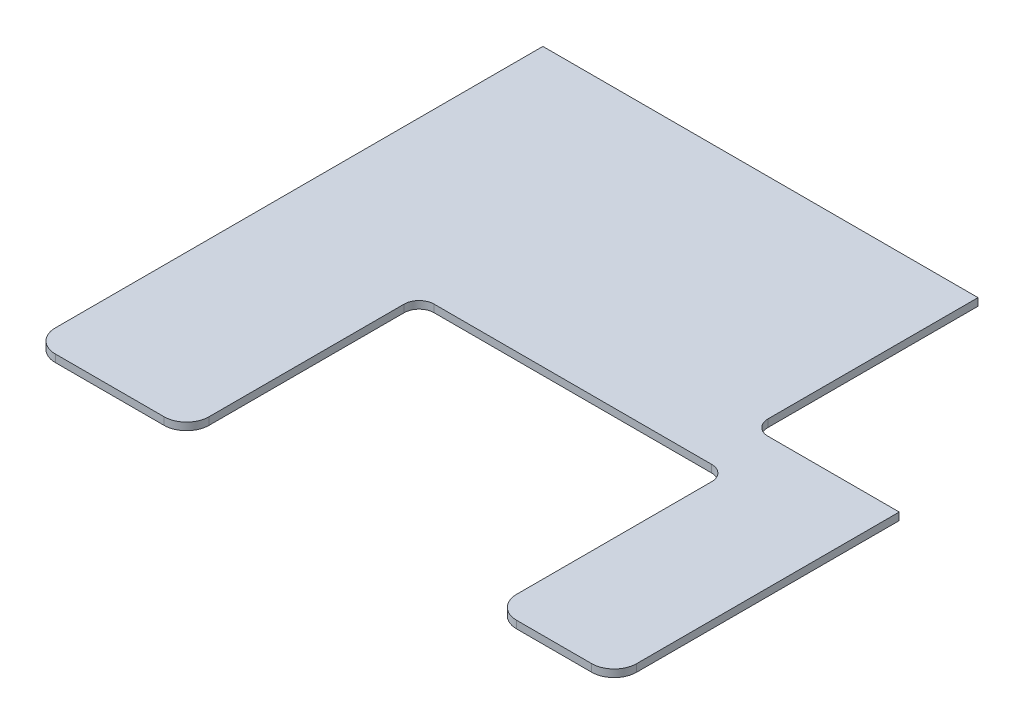
ISO-10303-21;
HEADER;
FILE_DESCRIPTION(('STEP AP214'),'2;1');
FILE_NAME('part.step','',(''),(''),'','','');
FILE_SCHEMA(('AUTOMOTIVE_DESIGN { 1 0 10303 214 1 1 1 1 }'));
ENDSEC;
DATA;
#1=APPLICATION_CONTEXT('core data for automotive mechanical design processes');
#2=APPLICATION_PROTOCOL_DEFINITION('international standard','automotive_design',2000,#1);
#3=PRODUCT_CONTEXT('',#1,'mechanical');
#4=PRODUCT('Part','Part','',(#3));
#5=PRODUCT_RELATED_PRODUCT_CATEGORY('part','',(#4));
#6=PRODUCT_DEFINITION_FORMATION('','',#4);
#7=PRODUCT_DEFINITION_CONTEXT('part definition',#1,'design');
#8=PRODUCT_DEFINITION('design','',#6,#7);
#9=PRODUCT_DEFINITION_SHAPE('','',#8);
#10=(LENGTH_UNIT() NAMED_UNIT(*) SI_UNIT(.MILLI.,.METRE.));
#11=(NAMED_UNIT(*) PLANE_ANGLE_UNIT() SI_UNIT($,.RADIAN.));
#12=(NAMED_UNIT(*) SI_UNIT($,.STERADIAN.) SOLID_ANGLE_UNIT());
#13=UNCERTAINTY_MEASURE_WITH_UNIT(LENGTH_MEASURE(1.E-05),#10,'distance_accuracy_value','');
#14=(GEOMETRIC_REPRESENTATION_CONTEXT(3) GLOBAL_UNCERTAINTY_ASSIGNED_CONTEXT((#13)) GLOBAL_UNIT_ASSIGNED_CONTEXT((#10,
#11,#12)) REPRESENTATION_CONTEXT('',''));
#15=CARTESIAN_POINT('',(0.,0.,0.));
#16=DIRECTION('',(0.,0.,1.));
#17=DIRECTION('',(1.,0.,0.));
#18=AXIS2_PLACEMENT_3D('',#15,#16,#17);
#19=CARTESIAN_POINT('',(387.5,10.,340.));
#20=DIRECTION('',(0.,0.,-1.));
#21=DIRECTION('',(-1.,0.,0.));
#22=AXIS2_PLACEMENT_3D('',#19,#20,#21);
#23=PLANE('',#22);
#24=DIRECTION('',(1.,0.,0.));
#25=VECTOR('',#24,1.);
#26=CARTESIAN_POINT('',(387.5,0.,340.));
#27=LINE('',#26,#25);
#28=CARTESIAN_POINT('',(-357.5,0.,340.));
#29=VERTEX_POINT('',#28);
#30=CARTESIAN_POINT('',(-212.5,0.,340.));
#31=VERTEX_POINT('',#30);
#32=EDGE_CURVE('E184',#29,#31,#27,.T.);
#33=ORIENTED_EDGE('',*,*,#32,.T.);
#34=DIRECTION('',(0.,1.,0.));
#35=VECTOR('',#34,1.);
#36=CARTESIAN_POINT('',(-212.5,10.,340.));
#37=LINE('',#36,#35);
#38=CARTESIAN_POINT('',(-212.5,10.,340.));
#39=VERTEX_POINT('',#38);
#40=EDGE_CURVE('E193',#31,#39,#37,.T.);
#41=ORIENTED_EDGE('',*,*,#40,.T.);
#42=DIRECTION('',(1.,0.,0.));
#43=VECTOR('',#42,1.);
#44=CARTESIAN_POINT('',(387.5,10.,340.));
#45=LINE('',#44,#43);
#46=CARTESIAN_POINT('',(-357.5,10.,340.));
#47=VERTEX_POINT('',#46);
#48=EDGE_CURVE('E269',#47,#39,#45,.T.);
#49=ORIENTED_EDGE('',*,*,#48,.F.);
#50=DIRECTION('',(0.,-1.,0.));
#51=VECTOR('',#50,1.);
#52=CARTESIAN_POINT('',(-357.5,10.,340.));
#53=LINE('',#52,#51);
#54=EDGE_CURVE('E190',#47,#29,#53,.T.);
#55=ORIENTED_EDGE('',*,*,#54,.T.);
#56=EDGE_LOOP('',(#33,#41,#49,#55));
#57=FACE_BOUND('',#56,.T.);
#58=ADVANCED_FACE('F34',(#57),#23,.F.);
#59=CARTESIAN_POINT('',(-387.5,10.,340.));
#60=DIRECTION('',(1.,0.,0.));
#61=DIRECTION('',(0.,0.,-1.));
#62=AXIS2_PLACEMENT_3D('',#59,#60,#61);
#63=PLANE('',#62);
#64=DIRECTION('',(0.,0.,1.));
#65=VECTOR('',#64,1.);
#66=CARTESIAN_POINT('',(-387.5,0.,340.));
#67=LINE('',#66,#65);
#68=CARTESIAN_POINT('',(-387.5,0.,-340.));
#69=VERTEX_POINT('',#68);
#70=CARTESIAN_POINT('',(-387.5,0.,310.));
#71=VERTEX_POINT('',#70);
#72=EDGE_CURVE('E177',#69,#71,#67,.T.);
#73=ORIENTED_EDGE('',*,*,#72,.T.);
#74=DIRECTION('',(0.,-1.,0.));
#75=VECTOR('',#74,1.);
#76=CARTESIAN_POINT('',(-387.5,10.,310.));
#77=LINE('',#76,#75);
#78=CARTESIAN_POINT('',(-387.5,10.,310.));
#79=VERTEX_POINT('',#78);
#80=EDGE_CURVE('E212',#71,#79,#77,.F.);
#81=ORIENTED_EDGE('',*,*,#80,.T.);
#82=DIRECTION('',(0.,0.,1.));
#83=VECTOR('',#82,1.);
#84=CARTESIAN_POINT('',(-387.5,10.,340.));
#85=LINE('',#84,#83);
#86=CARTESIAN_POINT('',(-387.5,10.,-340.));
#87=VERTEX_POINT('',#86);
#88=EDGE_CURVE('E178',#87,#79,#85,.T.);
#89=ORIENTED_EDGE('',*,*,#88,.F.);
#90=DIRECTION('',(0.,-1.,0.));
#91=VECTOR('',#90,1.);
#92=CARTESIAN_POINT('',(-387.5,10.,-340.));
#93=LINE('',#92,#91);
#94=EDGE_CURVE('E188',#87,#69,#93,.T.);
#95=ORIENTED_EDGE('',*,*,#94,.T.);
#96=EDGE_LOOP('',(#73,#81,#89,#95));
#97=FACE_BOUND('',#96,.T.);
#98=ADVANCED_FACE('F317',(#97),#63,.F.);
#99=CARTESIAN_POINT('',(257.5,10.,340.));
#100=VERTEX_POINT('',#99);
#101=CARTESIAN_POINT('',(357.5,10.,340.));
#102=VERTEX_POINT('',#101);
#103=EDGE_CURVE('E182',#100,#102,#45,.T.);
#104=ORIENTED_EDGE('',*,*,#103,.F.);
#105=DIRECTION('',(0.,1.,0.));
#106=VECTOR('',#105,1.);
#107=CARTESIAN_POINT('',(257.5,10.,340.));
#108=LINE('',#107,#106);
#109=CARTESIAN_POINT('',(257.5,0.,340.));
#110=VERTEX_POINT('',#109);
#111=EDGE_CURVE('E42',#100,#110,#108,.F.);
#112=ORIENTED_EDGE('',*,*,#111,.T.);
#113=CARTESIAN_POINT('',(357.5,0.,340.));
#114=VERTEX_POINT('',#113);
#115=EDGE_CURVE('E223',#110,#114,#27,.T.);
#116=ORIENTED_EDGE('',*,*,#115,.T.);
#117=DIRECTION('',(0.,-1.,0.));
#118=VECTOR('',#117,1.);
#119=CARTESIAN_POINT('',(357.5,10.,340.));
#120=LINE('',#119,#118);
#121=EDGE_CURVE('E217',#114,#102,#120,.F.);
#122=ORIENTED_EDGE('',*,*,#121,.T.);
#123=EDGE_LOOP('',(#104,#112,#116,#122));
#124=FACE_BOUND('',#123,.T.);
#125=ADVANCED_FACE('F222',(#124),#23,.F.);
#126=CARTESIAN_POINT('',(387.5,10.,340.));
#127=DIRECTION('',(-1.,0.,0.));
#128=DIRECTION('',(0.,0.,1.));
#129=AXIS2_PLACEMENT_3D('',#126,#127,#128);
#130=PLANE('',#129);
#131=DIRECTION('',(0.,0.,-1.));
#132=VECTOR('',#131,1.);
#133=CARTESIAN_POINT('',(387.5,10.,340.));
#134=LINE('',#133,#132);
#135=CARTESIAN_POINT('',(387.5,10.,310.));
#136=VERTEX_POINT('',#135);
#137=CARTESIAN_POINT('',(387.5,10.,-40.0000000000001));
#138=VERTEX_POINT('',#137);
#139=EDGE_CURVE('E270',#136,#138,#134,.T.);
#140=ORIENTED_EDGE('',*,*,#139,.F.);
#141=DIRECTION('',(0.,-1.,0.));
#142=VECTOR('',#141,1.);
#143=CARTESIAN_POINT('',(387.5,10.,310.));
#144=LINE('',#143,#142);
#145=CARTESIAN_POINT('',(387.5,0.,310.));
#146=VERTEX_POINT('',#145);
#147=EDGE_CURVE('E11',#136,#146,#144,.T.);
#148=ORIENTED_EDGE('',*,*,#147,.T.);
#149=DIRECTION('',(0.,0.,-1.));
#150=VECTOR('',#149,1.);
#151=CARTESIAN_POINT('',(387.5,0.,340.));
#152=LINE('',#151,#150);
#153=CARTESIAN_POINT('',(387.5,0.,-40.0000000000001));
#154=VERTEX_POINT('',#153);
#155=EDGE_CURVE('E179',#146,#154,#152,.T.);
#156=ORIENTED_EDGE('',*,*,#155,.T.);
#157=DIRECTION('',(0.,1.,0.));
#158=VECTOR('',#157,1.);
#159=CARTESIAN_POINT('',(387.5,0.,-40.0000000000001));
#160=LINE('',#159,#158);
#161=EDGE_CURVE('E273',#154,#138,#160,.T.);
#162=ORIENTED_EDGE('',*,*,#161,.T.);
#163=EDGE_LOOP('',(#140,#148,#156,#162));
#164=FACE_BOUND('',#163,.T.);
#165=ADVANCED_FACE('F334',(#164),#130,.F.);
#166=CARTESIAN_POINT('',(387.5,10.,-340.));
#167=DIRECTION('',(0.,0.,1.));
#168=DIRECTION('',(1.,0.,0.));
#169=AXIS2_PLACEMENT_3D('',#166,#167,#168);
#170=PLANE('',#169);
#171=DIRECTION('',(-1.,0.,0.));
#172=VECTOR('',#171,1.);
#173=CARTESIAN_POINT('',(387.5,10.,-340.));
#174=LINE('',#173,#172);
#175=CARTESIAN_POINT('',(192.5,10.,-340.));
#176=VERTEX_POINT('',#175);
#177=EDGE_CURVE('E172',#176,#87,#174,.T.);
#178=ORIENTED_EDGE('',*,*,#177,.F.);
#179=DIRECTION('',(0.,1.,0.));
#180=VECTOR('',#179,1.);
#181=CARTESIAN_POINT('',(192.5,0.,-340.));
#182=LINE('',#181,#180);
#183=CARTESIAN_POINT('',(192.5,0.,-340.));
#184=VERTEX_POINT('',#183);
#185=EDGE_CURVE('E158',#184,#176,#182,.T.);
#186=ORIENTED_EDGE('',*,*,#185,.F.);
#187=DIRECTION('',(-1.,0.,0.));
#188=VECTOR('',#187,1.);
#189=CARTESIAN_POINT('',(387.5,0.,-340.));
#190=LINE('',#189,#188);
#191=EDGE_CURVE('E170',#184,#69,#190,.T.);
#192=ORIENTED_EDGE('',*,*,#191,.T.);
#193=ORIENTED_EDGE('',*,*,#94,.F.);
#194=EDGE_LOOP('',(#178,#186,#192,#193));
#195=FACE_BOUND('',#194,.T.);
#196=ADVANCED_FACE('F168',(#195),#170,.F.);
#197=CARTESIAN_POINT('',(0.,10.,0.));
#198=DIRECTION('',(0.,1.,0.));
#199=DIRECTION('',(0.,0.,1.));
#200=AXIS2_PLACEMENT_3D('',#197,#198,#199);
#201=PLANE('',#200);
#202=ORIENTED_EDGE('',*,*,#48,.T.);
#203=CARTESIAN_POINT('',(-212.5,10.,310.));
#204=DIRECTION('',(0.,1.,0.));
#205=DIRECTION('',(0.,0.,1.));
#206=AXIS2_PLACEMENT_3D('',#203,#204,#205);
#207=CIRCLE('',#206,30.);
#208=CARTESIAN_POINT('',(-182.5,10.,310.));
#209=VERTEX_POINT('',#208);
#210=EDGE_CURVE('E202',#39,#209,#207,.T.);
#211=ORIENTED_EDGE('',*,*,#210,.T.);
#212=DIRECTION('',(0.,0.,1.));
#213=VECTOR('',#212,1.);
#214=CARTESIAN_POINT('',(-182.5,10.,340.));
#215=LINE('',#214,#213);
#216=CARTESIAN_POINT('',(-182.5,10.,50.0000000000002));
#217=VERTEX_POINT('',#216);
#218=EDGE_CURVE('E244',#217,#209,#215,.T.);
#219=ORIENTED_EDGE('',*,*,#218,.F.);
#220=CARTESIAN_POINT('',(-162.5,10.,50.));
#221=DIRECTION('',(0.,1.,0.));
#222=DIRECTION('',(0.,0.,-1.));
#223=AXIS2_PLACEMENT_3D('',#220,#221,#222);
#224=CIRCLE('',#223,20.);
#225=CARTESIAN_POINT('',(-162.5,10.,30.));
#226=VERTEX_POINT('',#225);
#227=EDGE_CURVE('E254',#226,#217,#224,.T.);
#228=ORIENTED_EDGE('',*,*,#227,.F.);
#229=DIRECTION('',(-1.,0.,0.));
#230=VECTOR('',#229,1.);
#231=CARTESIAN_POINT('',(-162.5,10.,30.));
#232=LINE('',#231,#230);
#233=CARTESIAN_POINT('',(207.5,10.,30.));
#234=VERTEX_POINT('',#233);
#235=EDGE_CURVE('E246',#234,#226,#232,.T.);
#236=ORIENTED_EDGE('',*,*,#235,.F.);
#237=CARTESIAN_POINT('',(207.5,10.,50.));
#238=DIRECTION('',(0.,1.,0.));
#239=DIRECTION('',(0.,0.,-1.));
#240=AXIS2_PLACEMENT_3D('',#237,#238,#239);
#241=CIRCLE('',#240,20.);
#242=CARTESIAN_POINT('',(227.5,10.,50.0000000000002));
#243=VERTEX_POINT('',#242);
#244=EDGE_CURVE('E243',#243,#234,#241,.T.);
#245=ORIENTED_EDGE('',*,*,#244,.F.);
#246=DIRECTION('',(0.,0.,-1.));
#247=VECTOR('',#246,1.);
#248=CARTESIAN_POINT('',(227.5,10.,340.));
#249=LINE('',#248,#247);
#250=CARTESIAN_POINT('',(227.5,10.,310.));
#251=VERTEX_POINT('',#250);
#252=EDGE_CURVE('E234',#251,#243,#249,.T.);
#253=ORIENTED_EDGE('',*,*,#252,.F.);
#254=CARTESIAN_POINT('',(257.5,10.,310.));
#255=DIRECTION('',(0.,1.,0.));
#256=DIRECTION('',(0.,0.,1.));
#257=AXIS2_PLACEMENT_3D('',#254,#255,#256);
#258=CIRCLE('',#257,30.);
#259=EDGE_CURVE('E198',#251,#100,#258,.T.);
#260=ORIENTED_EDGE('',*,*,#259,.T.);
#261=ORIENTED_EDGE('',*,*,#103,.T.);
#262=CARTESIAN_POINT('',(357.5,10.,310.));
#263=DIRECTION('',(0.,1.,0.));
#264=DIRECTION('',(0.,0.,1.));
#265=AXIS2_PLACEMENT_3D('',#262,#263,#264);
#266=CIRCLE('',#265,30.);
#267=EDGE_CURVE('E196',#102,#136,#266,.T.);
#268=ORIENTED_EDGE('',*,*,#267,.T.);
#269=ORIENTED_EDGE('',*,*,#139,.T.);
#270=DIRECTION('',(1.,0.,0.));
#271=VECTOR('',#270,1.);
#272=CARTESIAN_POINT('',(387.5,10.,-40.0000000000001));
#273=LINE('',#272,#271);
#274=CARTESIAN_POINT('',(212.5,10.,-40.0000000000001));
#275=VERTEX_POINT('',#274);
#276=EDGE_CURVE('E164',#275,#138,#273,.T.);
#277=ORIENTED_EDGE('',*,*,#276,.F.);
#278=CARTESIAN_POINT('',(212.5,10.,-60.0000000000001));
#279=DIRECTION('',(0.,1.,0.));
#280=DIRECTION('',(0.,0.,-1.));
#281=AXIS2_PLACEMENT_3D('',#278,#279,#280);
#282=CIRCLE('',#281,20.);
#283=CARTESIAN_POINT('',(192.5,10.,-60.0000000000003));
#284=VERTEX_POINT('',#283);
#285=EDGE_CURVE('E321',#284,#275,#282,.T.);
#286=ORIENTED_EDGE('',*,*,#285,.F.);
#287=DIRECTION('',(0.,0.,1.));
#288=VECTOR('',#287,1.);
#289=CARTESIAN_POINT('',(192.5,10.,-340.));
#290=LINE('',#289,#288);
#291=EDGE_CURVE('E260',#176,#284,#290,.T.);
#292=ORIENTED_EDGE('',*,*,#291,.F.);
#293=ORIENTED_EDGE('',*,*,#177,.T.);
#294=ORIENTED_EDGE('',*,*,#88,.T.);
#295=CARTESIAN_POINT('',(-357.5,10.,310.));
#296=DIRECTION('',(0.,1.,0.));
#297=DIRECTION('',(0.,0.,1.));
#298=AXIS2_PLACEMENT_3D('',#295,#296,#297);
#299=CIRCLE('',#298,30.);
#300=EDGE_CURVE('E200',#79,#47,#299,.T.);
#301=ORIENTED_EDGE('',*,*,#300,.T.);
#302=EDGE_LOOP('',(#202,#211,#219,#228,#236,#245,#253,#260,#261,#268,#269,#277,#286,#292,#293,
#294,#301));
#303=FACE_BOUND('',#302,.T.);
#304=ADVANCED_FACE('F240',(#303),#201,.T.);
#305=CARTESIAN_POINT('',(0.,0.,0.));
#306=DIRECTION('',(0.,1.,0.));
#307=DIRECTION('',(0.,0.,1.));
#308=AXIS2_PLACEMENT_3D('',#305,#306,#307);
#309=PLANE('',#308);
#310=DIRECTION('',(0.,0.,1.));
#311=VECTOR('',#310,1.);
#312=CARTESIAN_POINT('',(-182.5,0.,340.));
#313=LINE('',#312,#311);
#314=CARTESIAN_POINT('',(-182.5,0.,50.0000000000002));
#315=VERTEX_POINT('',#314);
#316=CARTESIAN_POINT('',(-182.5,0.,310.));
#317=VERTEX_POINT('',#316);
#318=EDGE_CURVE('E257',#315,#317,#313,.T.);
#319=ORIENTED_EDGE('',*,*,#318,.T.);
#320=CARTESIAN_POINT('',(-212.5,0.,310.));
#321=DIRECTION('',(0.,1.,0.));
#322=DIRECTION('',(0.,0.,1.));
#323=AXIS2_PLACEMENT_3D('',#320,#321,#322);
#324=CIRCLE('',#323,30.);
#325=EDGE_CURVE('E210',#317,#31,#324,.F.);
#326=ORIENTED_EDGE('',*,*,#325,.T.);
#327=ORIENTED_EDGE('',*,*,#32,.F.);
#328=CARTESIAN_POINT('',(-357.5,0.,310.));
#329=DIRECTION('',(0.,1.,0.));
#330=DIRECTION('',(0.,0.,1.));
#331=AXIS2_PLACEMENT_3D('',#328,#329,#330);
#332=CIRCLE('',#331,30.);
#333=EDGE_CURVE('E49',#29,#71,#332,.F.);
#334=ORIENTED_EDGE('',*,*,#333,.T.);
#335=ORIENTED_EDGE('',*,*,#72,.F.);
#336=ORIENTED_EDGE('',*,*,#191,.F.);
#337=DIRECTION('',(0.,0.,1.));
#338=VECTOR('',#337,1.);
#339=CARTESIAN_POINT('',(192.5,0.,-340.));
#340=LINE('',#339,#338);
#341=CARTESIAN_POINT('',(192.5,0.,-60.0000000000003));
#342=VERTEX_POINT('',#341);
#343=EDGE_CURVE('E154',#184,#342,#340,.T.);
#344=ORIENTED_EDGE('',*,*,#343,.T.);
#345=CARTESIAN_POINT('',(212.5,0.,-60.0000000000001));
#346=DIRECTION('',(0.,1.,0.));
#347=DIRECTION('',(0.,0.,-1.));
#348=AXIS2_PLACEMENT_3D('',#345,#346,#347);
#349=CIRCLE('',#348,20.);
#350=CARTESIAN_POINT('',(212.5,0.,-40.0000000000001));
#351=VERTEX_POINT('',#350);
#352=EDGE_CURVE('E163',#342,#351,#349,.T.);
#353=ORIENTED_EDGE('',*,*,#352,.T.);
#354=DIRECTION('',(1.,0.,0.));
#355=VECTOR('',#354,1.);
#356=CARTESIAN_POINT('',(387.5,0.,-40.0000000000001));
#357=LINE('',#356,#355);
#358=EDGE_CURVE('E173',#351,#154,#357,.T.);
#359=ORIENTED_EDGE('',*,*,#358,.T.);
#360=ORIENTED_EDGE('',*,*,#155,.F.);
#361=CARTESIAN_POINT('',(357.5,0.,310.));
#362=DIRECTION('',(0.,1.,0.));
#363=DIRECTION('',(0.,0.,1.));
#364=AXIS2_PLACEMENT_3D('',#361,#362,#363);
#365=CIRCLE('',#364,30.);
#366=EDGE_CURVE('E206',#146,#114,#365,.F.);
#367=ORIENTED_EDGE('',*,*,#366,.T.);
#368=ORIENTED_EDGE('',*,*,#115,.F.);
#369=CARTESIAN_POINT('',(257.5,0.,310.));
#370=DIRECTION('',(0.,1.,0.));
#371=DIRECTION('',(0.,0.,1.));
#372=AXIS2_PLACEMENT_3D('',#369,#370,#371);
#373=CIRCLE('',#372,30.);
#374=CARTESIAN_POINT('',(227.5,0.,310.));
#375=VERTEX_POINT('',#374);
#376=EDGE_CURVE('E56',#110,#375,#373,.F.);
#377=ORIENTED_EDGE('',*,*,#376,.T.);
#378=DIRECTION('',(0.,0.,-1.));
#379=VECTOR('',#378,1.);
#380=CARTESIAN_POINT('',(227.5,0.,340.));
#381=LINE('',#380,#379);
#382=CARTESIAN_POINT('',(227.5,0.,50.0000000000002));
#383=VERTEX_POINT('',#382);
#384=EDGE_CURVE('E236',#375,#383,#381,.T.);
#385=ORIENTED_EDGE('',*,*,#384,.T.);
#386=CARTESIAN_POINT('',(207.5,0.,50.));
#387=DIRECTION('',(0.,1.,0.));
#388=DIRECTION('',(0.,0.,-1.));
#389=AXIS2_PLACEMENT_3D('',#386,#387,#388);
#390=CIRCLE('',#389,20.);
#391=CARTESIAN_POINT('',(207.5,0.,30.));
#392=VERTEX_POINT('',#391);
#393=EDGE_CURVE('E289',#383,#392,#390,.T.);
#394=ORIENTED_EDGE('',*,*,#393,.T.);
#395=DIRECTION('',(-1.,0.,0.));
#396=VECTOR('',#395,1.);
#397=CARTESIAN_POINT('',(-162.5,0.,30.));
#398=LINE('',#397,#396);
#399=CARTESIAN_POINT('',(-162.5,0.,30.));
#400=VERTEX_POINT('',#399);
#401=EDGE_CURVE('E292',#392,#400,#398,.T.);
#402=ORIENTED_EDGE('',*,*,#401,.T.);
#403=CARTESIAN_POINT('',(-162.5,0.,50.));
#404=DIRECTION('',(0.,1.,0.));
#405=DIRECTION('',(0.,0.,-1.));
#406=AXIS2_PLACEMENT_3D('',#403,#404,#405);
#407=CIRCLE('',#406,20.);
#408=EDGE_CURVE('E266',#400,#315,#407,.T.);
#409=ORIENTED_EDGE('',*,*,#408,.T.);
#410=EDGE_LOOP('',(#319,#326,#327,#334,#335,#336,#344,#353,#359,#360,#367,#368,#377,#385,#394,
#402,#409));
#411=FACE_BOUND('',#410,.T.);
#412=ADVANCED_FACE('F176',(#411),#309,.F.);
#413=CARTESIAN_POINT('',(-182.5,0.,340.));
#414=DIRECTION('',(-1.,0.,0.));
#415=DIRECTION('',(0.,0.,1.));
#416=AXIS2_PLACEMENT_3D('',#413,#414,#415);
#417=PLANE('',#416);
#418=ORIENTED_EDGE('',*,*,#218,.T.);
#419=DIRECTION('',(0.,1.,0.));
#420=VECTOR('',#419,1.);
#421=CARTESIAN_POINT('',(-182.5,0.,310.));
#422=LINE('',#421,#420);
#423=EDGE_CURVE('E204',#209,#317,#422,.F.);
#424=ORIENTED_EDGE('',*,*,#423,.T.);
#425=ORIENTED_EDGE('',*,*,#318,.F.);
#426=DIRECTION('',(0.,1.,0.));
#427=VECTOR('',#426,1.);
#428=CARTESIAN_POINT('',(-182.5,0.,50.0000000000002));
#429=LINE('',#428,#427);
#430=EDGE_CURVE('E258',#315,#217,#429,.T.);
#431=ORIENTED_EDGE('',*,*,#430,.T.);
#432=EDGE_LOOP('',(#418,#424,#425,#431));
#433=FACE_BOUND('',#432,.T.);
#434=ADVANCED_FACE('F304',(#433),#417,.F.);
#435=CARTESIAN_POINT('',(-162.5,0.,50.));
#436=DIRECTION('',(0.,1.,0.));
#437=DIRECTION('',(0.,0.,1.));
#438=AXIS2_PLACEMENT_3D('',#435,#436,#437);
#439=CYLINDRICAL_SURFACE('',#438,20.);
#440=ORIENTED_EDGE('',*,*,#227,.T.);
#441=ORIENTED_EDGE('',*,*,#430,.F.);
#442=ORIENTED_EDGE('',*,*,#408,.F.);
#443=DIRECTION('',(0.,1.,0.));
#444=VECTOR('',#443,1.);
#445=CARTESIAN_POINT('',(-162.5,0.,30.));
#446=LINE('',#445,#444);
#447=EDGE_CURVE('E261',#400,#226,#446,.T.);
#448=ORIENTED_EDGE('',*,*,#447,.T.);
#449=EDGE_LOOP('',(#440,#441,#442,#448));
#450=FACE_BOUND('',#449,.T.);
#451=ADVANCED_FACE('F300',(#450),#439,.F.);
#452=CARTESIAN_POINT('',(-162.5,0.,30.));
#453=DIRECTION('',(0.,0.,-1.));
#454=DIRECTION('',(-1.,0.,0.));
#455=AXIS2_PLACEMENT_3D('',#452,#453,#454);
#456=PLANE('',#455);
#457=ORIENTED_EDGE('',*,*,#235,.T.);
#458=ORIENTED_EDGE('',*,*,#447,.F.);
#459=ORIENTED_EDGE('',*,*,#401,.F.);
#460=DIRECTION('',(0.,1.,0.));
#461=VECTOR('',#460,1.);
#462=CARTESIAN_POINT('',(207.5,0.,30.));
#463=LINE('',#462,#461);
#464=EDGE_CURVE('E263',#392,#234,#463,.T.);
#465=ORIENTED_EDGE('',*,*,#464,.T.);
#466=EDGE_LOOP('',(#457,#458,#459,#465));
#467=FACE_BOUND('',#466,.T.);
#468=ADVANCED_FACE('F367',(#467),#456,.F.);
#469=CARTESIAN_POINT('',(207.5,0.,50.));
#470=DIRECTION('',(0.,1.,0.));
#471=DIRECTION('',(0.,0.,1.));
#472=AXIS2_PLACEMENT_3D('',#469,#470,#471);
#473=CYLINDRICAL_SURFACE('',#472,20.);
#474=ORIENTED_EDGE('',*,*,#244,.T.);
#475=ORIENTED_EDGE('',*,*,#464,.F.);
#476=ORIENTED_EDGE('',*,*,#393,.F.);
#477=DIRECTION('',(0.,1.,0.));
#478=VECTOR('',#477,1.);
#479=CARTESIAN_POINT('',(227.5,0.,50.0000000000002));
#480=LINE('',#479,#478);
#481=EDGE_CURVE('E265',#383,#243,#480,.T.);
#482=ORIENTED_EDGE('',*,*,#481,.T.);
#483=EDGE_LOOP('',(#474,#475,#476,#482));
#484=FACE_BOUND('',#483,.T.);
#485=ADVANCED_FACE('F364',(#484),#473,.F.);
#486=CARTESIAN_POINT('',(227.5,0.,340.));
#487=DIRECTION('',(1.,0.,0.));
#488=DIRECTION('',(0.,0.,-1.));
#489=AXIS2_PLACEMENT_3D('',#486,#487,#488);
#490=PLANE('',#489);
#491=ORIENTED_EDGE('',*,*,#384,.F.);
#492=DIRECTION('',(0.,1.,0.));
#493=VECTOR('',#492,1.);
#494=CARTESIAN_POINT('',(227.5,0.,310.));
#495=LINE('',#494,#493);
#496=EDGE_CURVE('E214',#375,#251,#495,.T.);
#497=ORIENTED_EDGE('',*,*,#496,.T.);
#498=ORIENTED_EDGE('',*,*,#252,.T.);
#499=ORIENTED_EDGE('',*,*,#481,.F.);
#500=EDGE_LOOP('',(#491,#497,#498,#499));
#501=FACE_BOUND('',#500,.T.);
#502=ADVANCED_FACE('F232',(#501),#490,.F.);
#503=CARTESIAN_POINT('',(387.5,0.,-40.0000000000001));
#504=DIRECTION('',(0.,0.,1.));
#505=DIRECTION('',(1.,0.,0.));
#506=AXIS2_PLACEMENT_3D('',#503,#504,#505);
#507=PLANE('',#506);
#508=ORIENTED_EDGE('',*,*,#276,.T.);
#509=ORIENTED_EDGE('',*,*,#161,.F.);
#510=ORIENTED_EDGE('',*,*,#358,.F.);
#511=DIRECTION('',(0.,1.,0.));
#512=VECTOR('',#511,1.);
#513=CARTESIAN_POINT('',(212.5,0.,-40.0000000000001));
#514=LINE('',#513,#512);
#515=EDGE_CURVE('E277',#351,#275,#514,.T.);
#516=ORIENTED_EDGE('',*,*,#515,.T.);
#517=EDGE_LOOP('',(#508,#509,#510,#516));
#518=FACE_BOUND('',#517,.T.);
#519=ADVANCED_FACE('F331',(#518),#507,.F.);
#520=CARTESIAN_POINT('',(212.5,0.,-60.0000000000001));
#521=DIRECTION('',(0.,1.,0.));
#522=DIRECTION('',(0.,0.,1.));
#523=AXIS2_PLACEMENT_3D('',#520,#521,#522);
#524=CYLINDRICAL_SURFACE('',#523,20.);
#525=ORIENTED_EDGE('',*,*,#285,.T.);
#526=ORIENTED_EDGE('',*,*,#515,.F.);
#527=ORIENTED_EDGE('',*,*,#352,.F.);
#528=DIRECTION('',(0.,1.,0.));
#529=VECTOR('',#528,1.);
#530=CARTESIAN_POINT('',(192.5,0.,-60.0000000000003));
#531=LINE('',#530,#529);
#532=EDGE_CURVE('E160',#342,#284,#531,.T.);
#533=ORIENTED_EDGE('',*,*,#532,.T.);
#534=EDGE_LOOP('',(#525,#526,#527,#533));
#535=FACE_BOUND('',#534,.T.);
#536=ADVANCED_FACE('F328',(#535),#524,.F.);
#537=CARTESIAN_POINT('',(192.5,0.,-340.));
#538=DIRECTION('',(-1.,0.,0.));
#539=DIRECTION('',(0.,0.,1.));
#540=AXIS2_PLACEMENT_3D('',#537,#538,#539);
#541=PLANE('',#540);
#542=ORIENTED_EDGE('',*,*,#291,.T.);
#543=ORIENTED_EDGE('',*,*,#532,.F.);
#544=ORIENTED_EDGE('',*,*,#343,.F.);
#545=ORIENTED_EDGE('',*,*,#185,.T.);
#546=EDGE_LOOP('',(#542,#543,#544,#545));
#547=FACE_BOUND('',#546,.T.);
#548=ADVANCED_FACE('F157',(#547),#541,.F.);
#549=CARTESIAN_POINT('',(-212.5,10.,310.));
#550=DIRECTION('',(0.,1.,0.));
#551=DIRECTION('',(0.,0.,1.));
#552=AXIS2_PLACEMENT_3D('',#549,#550,#551);
#553=CYLINDRICAL_SURFACE('',#552,30.);
#554=ORIENTED_EDGE('',*,*,#325,.F.);
#555=ORIENTED_EDGE('',*,*,#423,.F.);
#556=ORIENTED_EDGE('',*,*,#210,.F.);
#557=ORIENTED_EDGE('',*,*,#40,.F.);
#558=EDGE_LOOP('',(#554,#555,#556,#557));
#559=FACE_BOUND('',#558,.T.);
#560=ADVANCED_FACE('F307',(#559),#553,.T.);
#561=CARTESIAN_POINT('',(-357.5,10.,310.));
#562=DIRECTION('',(0.,-1.,0.));
#563=DIRECTION('',(0.,0.,-1.));
#564=AXIS2_PLACEMENT_3D('',#561,#562,#563);
#565=CYLINDRICAL_SURFACE('',#564,30.);
#566=ORIENTED_EDGE('',*,*,#300,.F.);
#567=ORIENTED_EDGE('',*,*,#80,.F.);
#568=ORIENTED_EDGE('',*,*,#333,.F.);
#569=ORIENTED_EDGE('',*,*,#54,.F.);
#570=EDGE_LOOP('',(#566,#567,#568,#569));
#571=FACE_BOUND('',#570,.T.);
#572=ADVANCED_FACE('F315',(#571),#565,.T.);
#573=CARTESIAN_POINT('',(257.5,0.,310.));
#574=DIRECTION('',(0.,1.,0.));
#575=DIRECTION('',(0.,0.,1.));
#576=AXIS2_PLACEMENT_3D('',#573,#574,#575);
#577=CYLINDRICAL_SURFACE('',#576,30.);
#578=ORIENTED_EDGE('',*,*,#376,.F.);
#579=ORIENTED_EDGE('',*,*,#111,.F.);
#580=ORIENTED_EDGE('',*,*,#259,.F.);
#581=ORIENTED_EDGE('',*,*,#496,.F.);
#582=EDGE_LOOP('',(#578,#579,#580,#581));
#583=FACE_BOUND('',#582,.T.);
#584=ADVANCED_FACE('F229',(#583),#577,.T.);
#585=CARTESIAN_POINT('',(357.5,10.,310.));
#586=DIRECTION('',(0.,-1.,0.));
#587=DIRECTION('',(0.,0.,-1.));
#588=AXIS2_PLACEMENT_3D('',#585,#586,#587);
#589=CYLINDRICAL_SURFACE('',#588,30.);
#590=ORIENTED_EDGE('',*,*,#267,.F.);
#591=ORIENTED_EDGE('',*,*,#121,.F.);
#592=ORIENTED_EDGE('',*,*,#366,.F.);
#593=ORIENTED_EDGE('',*,*,#147,.F.);
#594=EDGE_LOOP('',(#590,#591,#592,#593));
#595=FACE_BOUND('',#594,.T.);
#596=ADVANCED_FACE('F36',(#595),#589,.T.);
#597=CLOSED_SHELL('',(#58,#98,#125,#165,#196,#304,#412,#434,#451,#468,#485,#502,#519,#536,#548,
#560,#572,#584,#596));
#598=MANIFOLD_SOLID_BREP('B2',#597);
#599=ADVANCED_BREP_SHAPE_REPRESENTATION('',(#18,#598),#14);
#600=SHAPE_DEFINITION_REPRESENTATION(#9,#599);
ENDSEC;
END-ISO-10303-21;
